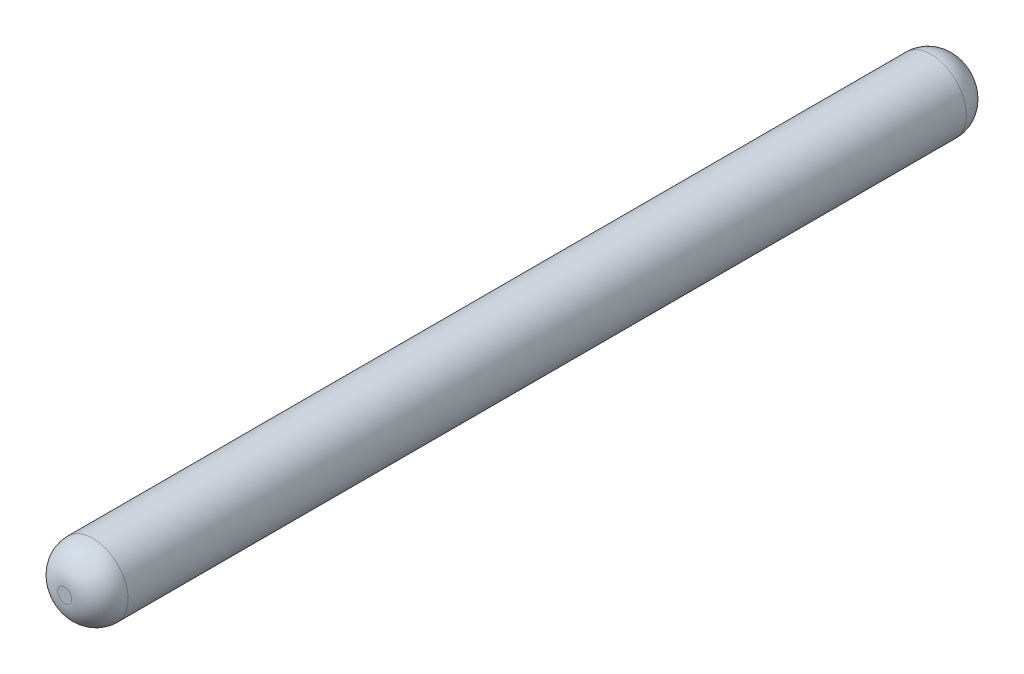
ISO-10303-21;
HEADER;
FILE_DESCRIPTION(('STEP AP214'),'2;1');
FILE_NAME('part.step','',(''),(''),'','','');
FILE_SCHEMA(('AUTOMOTIVE_DESIGN { 1 0 10303 214 1 1 1 1 }'));
ENDSEC;
DATA;
#1=APPLICATION_CONTEXT('core data for automotive mechanical design processes');
#2=APPLICATION_PROTOCOL_DEFINITION('international standard','automotive_design',2000,#1);
#3=PRODUCT_CONTEXT('',#1,'mechanical');
#4=PRODUCT('Part','Part','',(#3));
#5=PRODUCT_RELATED_PRODUCT_CATEGORY('part','',(#4));
#6=PRODUCT_DEFINITION_FORMATION('','',#4);
#7=PRODUCT_DEFINITION_CONTEXT('part definition',#1,'design');
#8=PRODUCT_DEFINITION('design','',#6,#7);
#9=PRODUCT_DEFINITION_SHAPE('','',#8);
#10=(LENGTH_UNIT() NAMED_UNIT(*) SI_UNIT(.MILLI.,.METRE.));
#11=(NAMED_UNIT(*) PLANE_ANGLE_UNIT() SI_UNIT($,.RADIAN.));
#12=(NAMED_UNIT(*) SI_UNIT($,.STERADIAN.) SOLID_ANGLE_UNIT());
#13=UNCERTAINTY_MEASURE_WITH_UNIT(LENGTH_MEASURE(1.E-05),#10,'distance_accuracy_value','');
#14=(GEOMETRIC_REPRESENTATION_CONTEXT(3) GLOBAL_UNCERTAINTY_ASSIGNED_CONTEXT((#13)) GLOBAL_UNIT_ASSIGNED_CONTEXT((#10,
#11,#12)) REPRESENTATION_CONTEXT('',''));
#15=CARTESIAN_POINT('',(0.,0.,0.));
#16=DIRECTION('',(0.,0.,1.));
#17=DIRECTION('',(1.,0.,0.));
#18=AXIS2_PLACEMENT_3D('',#15,#16,#17);
#19=CARTESIAN_POINT('',(0.,0.,12.7));
#20=DIRECTION('',(0.,0.,-1.));
#21=DIRECTION('',(-1.,0.,0.));
#22=AXIS2_PLACEMENT_3D('',#19,#20,#21);
#23=CYLINDRICAL_SURFACE('',#22,0.5);
#24=CARTESIAN_POINT('',(0.,0.,0.399999999999999));
#25=DIRECTION('',(0.,0.,1.));
#26=DIRECTION('',(1.,0.,0.));
#27=AXIS2_PLACEMENT_3D('',#24,#25,#26);
#28=CIRCLE('',#27,0.5);
#29=CARTESIAN_POINT('',(0.5,0.,0.399999999999999));
#30=VERTEX_POINT('',#29);
#31=EDGE_CURVE('E41',#30,#30,#28,.T.);
#32=ORIENTED_EDGE('',*,*,#31,.T.);
#33=EDGE_LOOP('',(#32));
#34=FACE_BOUND('',#33,.T.);
#35=CARTESIAN_POINT('',(0.,0.,12.3));
#36=DIRECTION('',(0.,0.,1.));
#37=DIRECTION('',(1.,0.,0.));
#38=AXIS2_PLACEMENT_3D('',#35,#36,#37);
#39=CIRCLE('',#38,0.5);
#40=CARTESIAN_POINT('',(0.5,0.,12.3));
#41=VERTEX_POINT('',#40);
#42=EDGE_CURVE('E45',#41,#41,#39,.F.);
#43=ORIENTED_EDGE('',*,*,#42,.T.);
#44=EDGE_LOOP('',(#43));
#45=FACE_BOUND('',#44,.T.);
#46=ADVANCED_FACE('F30',(#34,#45),#23,.T.);
#47=CARTESIAN_POINT('',(0.,0.,12.7));
#48=DIRECTION('',(0.,0.,1.));
#49=DIRECTION('',(1.,0.,0.));
#50=AXIS2_PLACEMENT_3D('',#47,#48,#49);
#51=PLANE('',#50);
#52=CARTESIAN_POINT('',(0.,0.,12.7));
#53=DIRECTION('',(0.,0.,1.));
#54=DIRECTION('',(1.,0.,0.));
#55=AXIS2_PLACEMENT_3D('',#52,#53,#54);
#56=CIRCLE('',#55,0.1);
#57=CARTESIAN_POINT('',(0.1,0.,12.7));
#58=VERTEX_POINT('',#57);
#59=EDGE_CURVE('E10',#58,#58,#56,.T.);
#60=ORIENTED_EDGE('',*,*,#59,.T.);
#61=EDGE_LOOP('',(#60));
#62=FACE_BOUND('',#61,.T.);
#63=ADVANCED_FACE('F61',(#62),#51,.T.);
#64=CARTESIAN_POINT('',(0.,0.,0.));
#65=DIRECTION('',(0.,0.,1.));
#66=DIRECTION('',(1.,0.,0.));
#67=AXIS2_PLACEMENT_3D('',#64,#65,#66);
#68=PLANE('',#67);
#69=CARTESIAN_POINT('',(0.,0.,0.));
#70=DIRECTION('',(0.,0.,1.));
#71=DIRECTION('',(1.,0.,0.));
#72=AXIS2_PLACEMENT_3D('',#69,#70,#71);
#73=CIRCLE('',#72,0.1);
#74=CARTESIAN_POINT('',(0.1,0.,0.));
#75=VERTEX_POINT('',#74);
#76=EDGE_CURVE('E37',#75,#75,#73,.F.);
#77=ORIENTED_EDGE('',*,*,#76,.T.);
#78=EDGE_LOOP('',(#77));
#79=FACE_BOUND('',#78,.T.);
#80=ADVANCED_FACE('F58',(#79),#68,.F.);
#81=CARTESIAN_POINT('',(0.,0.,0.399999999999999));
#82=DIRECTION('',(0.,0.,1.));
#83=DIRECTION('',(1.,0.,0.));
#84=AXIS2_PLACEMENT_3D('',#81,#82,#83);
#85=DEGENERATE_TOROIDAL_SURFACE('',#84,0.1,0.4,.T.);
#86=ORIENTED_EDGE('',*,*,#76,.F.);
#87=EDGE_LOOP('',(#86));
#88=FACE_BOUND('',#87,.T.);
#89=ORIENTED_EDGE('',*,*,#31,.F.);
#90=EDGE_LOOP('',(#89));
#91=FACE_BOUND('',#90,.T.);
#92=ADVANCED_FACE('F54',(#88,#91),#85,.T.);
#93=CARTESIAN_POINT('',(0.,0.,12.3));
#94=DIRECTION('',(0.,0.,1.));
#95=DIRECTION('',(1.,0.,0.));
#96=AXIS2_PLACEMENT_3D('',#93,#94,#95);
#97=DEGENERATE_TOROIDAL_SURFACE('',#96,0.1,0.4,.T.);
#98=ORIENTED_EDGE('',*,*,#42,.F.);
#99=EDGE_LOOP('',(#98));
#100=FACE_BOUND('',#99,.T.);
#101=ORIENTED_EDGE('',*,*,#59,.F.);
#102=EDGE_LOOP('',(#101));
#103=FACE_BOUND('',#102,.T.);
#104=ADVANCED_FACE('F32',(#100,#103),#97,.T.);
#105=CLOSED_SHELL('',(#46,#63,#80,#92,#104));
#106=MANIFOLD_SOLID_BREP('B2',#105);
#107=ADVANCED_BREP_SHAPE_REPRESENTATION('',(#18,#106),#14);
#108=SHAPE_DEFINITION_REPRESENTATION(#9,#107);
ENDSEC;
END-ISO-10303-21;
